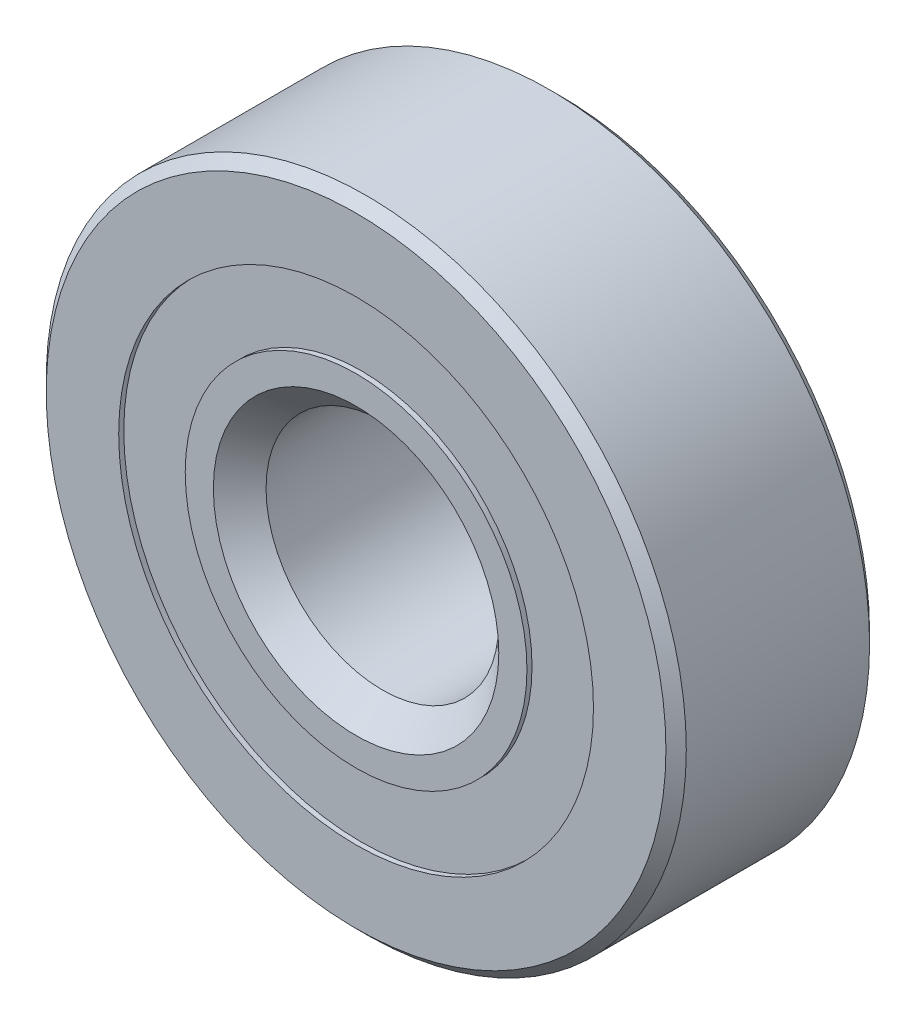
ISO-10303-21;
HEADER;
FILE_DESCRIPTION(('STEP AP214'),'2;1');
FILE_NAME('part.step','',(''),(''),'','','');
FILE_SCHEMA(('AUTOMOTIVE_DESIGN { 1 0 10303 214 1 1 1 1 }'));
ENDSEC;
DATA;
#1=APPLICATION_CONTEXT('core data for automotive mechanical design processes');
#2=APPLICATION_PROTOCOL_DEFINITION('international standard','automotive_design',2000,#1);
#3=PRODUCT_CONTEXT('',#1,'mechanical');
#4=PRODUCT('Part','Part','',(#3));
#5=PRODUCT_RELATED_PRODUCT_CATEGORY('part','',(#4));
#6=PRODUCT_DEFINITION_FORMATION('','',#4);
#7=PRODUCT_DEFINITION_CONTEXT('part definition',#1,'design');
#8=PRODUCT_DEFINITION('design','',#6,#7);
#9=PRODUCT_DEFINITION_SHAPE('','',#8);
#10=(LENGTH_UNIT() NAMED_UNIT(*) SI_UNIT(.MILLI.,.METRE.));
#11=(NAMED_UNIT(*) PLANE_ANGLE_UNIT() SI_UNIT($,.RADIAN.));
#12=(NAMED_UNIT(*) SI_UNIT($,.STERADIAN.) SOLID_ANGLE_UNIT());
#13=UNCERTAINTY_MEASURE_WITH_UNIT(LENGTH_MEASURE(1.E-05),#10,'distance_accuracy_value','');
#14=(GEOMETRIC_REPRESENTATION_CONTEXT(3) GLOBAL_UNCERTAINTY_ASSIGNED_CONTEXT((#13)) GLOBAL_UNIT_ASSIGNED_CONTEXT((#10,
#11,#12)) REPRESENTATION_CONTEXT('',''));
#15=CARTESIAN_POINT('',(0.,0.,0.));
#16=DIRECTION('',(0.,0.,1.));
#17=DIRECTION('',(1.,0.,0.));
#18=AXIS2_PLACEMENT_3D('',#15,#16,#17);
#19=CARTESIAN_POINT('',(0.,8.15934065934065,-3.32500000000001));
#20=DIRECTION('',(0.,0.,1.));
#21=DIRECTION('',(1.,0.,0.));
#22=AXIS2_PLACEMENT_3D('',#19,#20,#21);
#23=PLANE('',#22);
#24=CARTESIAN_POINT('',(0.,0.,-3.32500000000001));
#25=DIRECTION('',(0.,0.,1.));
#26=DIRECTION('',(1.,0.,0.));
#27=AXIS2_PLACEMENT_3D('',#24,#25,#26);
#28=CIRCLE('',#27,8.15934065934065);
#29=CARTESIAN_POINT('',(8.15934065934065,0.,-3.32500000000001));
#30=VERTEX_POINT('',#29);
#31=EDGE_CURVE('E57',#30,#30,#28,.T.);
#32=ORIENTED_EDGE('',*,*,#31,.F.);
#33=EDGE_LOOP('',(#32));
#34=FACE_BOUND('',#33,.T.);
#35=CARTESIAN_POINT('',(0.,0.,-3.32500000000001));
#36=DIRECTION('',(0.,0.,1.));
#37=DIRECTION('',(1.,0.,0.));
#38=AXIS2_PLACEMENT_3D('',#35,#36,#37);
#39=CIRCLE('',#38,5.87294927368765);
#40=CARTESIAN_POINT('',(5.87294927368765,0.,-3.32500000000001));
#41=VERTEX_POINT('',#40);
#42=EDGE_CURVE('E11',#41,#41,#39,.T.);
#43=ORIENTED_EDGE('',*,*,#42,.T.);
#44=EDGE_LOOP('',(#43));
#45=FACE_BOUND('',#44,.T.);
#46=ADVANCED_FACE('F43',(#34,#45),#23,.F.);
#47=CARTESIAN_POINT('',(0.,0.,3.5));
#48=DIRECTION('',(0.,0.,1.));
#49=DIRECTION('',(1.,0.,0.));
#50=AXIS2_PLACEMENT_3D('',#47,#48,#49);
#51=CYLINDRICAL_SURFACE('',#50,5.87294927368765);
#52=ORIENTED_EDGE('',*,*,#42,.F.);
#53=EDGE_LOOP('',(#52));
#54=FACE_BOUND('',#53,.T.);
#55=CARTESIAN_POINT('',(0.,0.,-1.68952158656809));
#56=DIRECTION('',(0.,0.,1.));
#57=DIRECTION('',(1.,0.,0.));
#58=AXIS2_PLACEMENT_3D('',#55,#56,#57);
#59=CIRCLE('',#58,5.87294927368765);
#60=CARTESIAN_POINT('',(5.87294927368765,0.,-1.68952158656809));
#61=VERTEX_POINT('',#60);
#62=EDGE_CURVE('E49',#61,#61,#59,.T.);
#63=ORIENTED_EDGE('',*,*,#62,.T.);
#64=EDGE_LOOP('',(#63));
#65=FACE_BOUND('',#64,.T.);
#66=ADVANCED_FACE('F66',(#54,#65),#51,.F.);
#67=CARTESIAN_POINT('',(0.,8.15934065934065,-1.68952158656809));
#68=DIRECTION('',(0.,0.,-1.));
#69=DIRECTION('',(-1.,0.,0.));
#70=AXIS2_PLACEMENT_3D('',#67,#68,#69);
#71=PLANE('',#70);
#72=ORIENTED_EDGE('',*,*,#62,.F.);
#73=EDGE_LOOP('',(#72));
#74=FACE_BOUND('',#73,.T.);
#75=CARTESIAN_POINT('',(0.,0.,-1.68952158656809));
#76=DIRECTION('',(0.,0.,1.));
#77=DIRECTION('',(1.,0.,0.));
#78=AXIS2_PLACEMENT_3D('',#75,#76,#77);
#79=CIRCLE('',#78,8.15934065934065);
#80=CARTESIAN_POINT('',(8.15934065934065,0.,-1.68952158656809));
#81=VERTEX_POINT('',#80);
#82=EDGE_CURVE('E53',#81,#81,#79,.T.);
#83=ORIENTED_EDGE('',*,*,#82,.T.);
#84=EDGE_LOOP('',(#83));
#85=FACE_BOUND('',#84,.T.);
#86=ADVANCED_FACE('F70',(#74,#85),#71,.F.);
#87=CARTESIAN_POINT('',(0.,0.,3.5));
#88=DIRECTION('',(0.,0.,1.));
#89=DIRECTION('',(1.,0.,0.));
#90=AXIS2_PLACEMENT_3D('',#87,#88,#89);
#91=CYLINDRICAL_SURFACE('',#90,8.15934065934065);
#92=ORIENTED_EDGE('',*,*,#82,.F.);
#93=EDGE_LOOP('',(#92));
#94=FACE_BOUND('',#93,.T.);
#95=ORIENTED_EDGE('',*,*,#31,.T.);
#96=EDGE_LOOP('',(#95));
#97=FACE_BOUND('',#96,.T.);
#98=ADVANCED_FACE('F63',(#94,#97),#91,.T.);
#99=CLOSED_SHELL('',(#46,#66,#86,#98));
#100=MANIFOLD_SOLID_BREP('B2',#99);
#101=CARTESIAN_POINT('',(0.,8.15934065934065,3.325));
#102=DIRECTION('',(0.,0.,-1.));
#103=DIRECTION('',(-1.,0.,0.));
#104=AXIS2_PLACEMENT_3D('',#101,#102,#103);
#105=PLANE('',#104);
#106=CARTESIAN_POINT('',(0.,0.,3.325));
#107=DIRECTION('',(0.,0.,1.));
#108=DIRECTION('',(1.,0.,0.));
#109=AXIS2_PLACEMENT_3D('',#106,#107,#108);
#110=CIRCLE('',#109,5.87294927368765);
#111=CARTESIAN_POINT('',(5.87294927368765,0.,3.325));
#112=VERTEX_POINT('',#111);
#113=EDGE_CURVE('E42',#112,#112,#110,.T.);
#114=ORIENTED_EDGE('',*,*,#113,.F.);
#115=EDGE_LOOP('',(#114));
#116=FACE_BOUND('',#115,.T.);
#117=CARTESIAN_POINT('',(0.,0.,3.325));
#118=DIRECTION('',(0.,0.,1.));
#119=DIRECTION('',(1.,0.,0.));
#120=AXIS2_PLACEMENT_3D('',#117,#118,#119);
#121=CIRCLE('',#120,8.15934065934065);
#122=CARTESIAN_POINT('',(8.15934065934065,0.,3.325));
#123=VERTEX_POINT('',#122);
#124=EDGE_CURVE('E124',#123,#123,#121,.T.);
#125=ORIENTED_EDGE('',*,*,#124,.T.);
#126=EDGE_LOOP('',(#125));
#127=FACE_BOUND('',#126,.T.);
#128=ADVANCED_FACE('F110',(#116,#127),#105,.F.);
#129=CARTESIAN_POINT('',(0.,0.,3.5));
#130=DIRECTION('',(0.,0.,1.));
#131=DIRECTION('',(1.,0.,0.));
#132=AXIS2_PLACEMENT_3D('',#129,#130,#131);
#133=CYLINDRICAL_SURFACE('',#132,5.87294927368765);
#134=CARTESIAN_POINT('',(0.,0.,1.68952158656808));
#135=DIRECTION('',(0.,0.,1.));
#136=DIRECTION('',(1.,0.,0.));
#137=AXIS2_PLACEMENT_3D('',#134,#135,#136);
#138=CIRCLE('',#137,5.87294927368765);
#139=CARTESIAN_POINT('',(5.87294927368765,0.,1.68952158656808));
#140=VERTEX_POINT('',#139);
#141=EDGE_CURVE('E116',#140,#140,#138,.T.);
#142=ORIENTED_EDGE('',*,*,#141,.F.);
#143=EDGE_LOOP('',(#142));
#144=FACE_BOUND('',#143,.T.);
#145=ORIENTED_EDGE('',*,*,#113,.T.);
#146=EDGE_LOOP('',(#145));
#147=FACE_BOUND('',#146,.T.);
#148=ADVANCED_FACE('F139',(#144,#147),#133,.F.);
#149=CARTESIAN_POINT('',(0.,8.15934065934065,1.68952158656808));
#150=DIRECTION('',(0.,0.,1.));
#151=DIRECTION('',(1.,0.,0.));
#152=AXIS2_PLACEMENT_3D('',#149,#150,#151);
#153=PLANE('',#152);
#154=CARTESIAN_POINT('',(0.,0.,1.68952158656808));
#155=DIRECTION('',(0.,0.,1.));
#156=DIRECTION('',(1.,0.,0.));
#157=AXIS2_PLACEMENT_3D('',#154,#155,#156);
#158=CIRCLE('',#157,8.15934065934065);
#159=CARTESIAN_POINT('',(8.15934065934065,0.,1.68952158656808));
#160=VERTEX_POINT('',#159);
#161=EDGE_CURVE('E120',#160,#160,#158,.T.);
#162=ORIENTED_EDGE('',*,*,#161,.F.);
#163=EDGE_LOOP('',(#162));
#164=FACE_BOUND('',#163,.T.);
#165=ORIENTED_EDGE('',*,*,#141,.T.);
#166=EDGE_LOOP('',(#165));
#167=FACE_BOUND('',#166,.T.);
#168=ADVANCED_FACE('F134',(#164,#167),#153,.F.);
#169=CARTESIAN_POINT('',(0.,0.,3.5));
#170=DIRECTION('',(0.,0.,1.));
#171=DIRECTION('',(1.,0.,0.));
#172=AXIS2_PLACEMENT_3D('',#169,#170,#171);
#173=CYLINDRICAL_SURFACE('',#172,8.15934065934065);
#174=ORIENTED_EDGE('',*,*,#124,.F.);
#175=EDGE_LOOP('',(#174));
#176=FACE_BOUND('',#175,.T.);
#177=ORIENTED_EDGE('',*,*,#161,.T.);
#178=EDGE_LOOP('',(#177));
#179=FACE_BOUND('',#178,.T.);
#180=ADVANCED_FACE('F131',(#176,#179),#173,.T.);
#181=CLOSED_SHELL('',(#128,#148,#168,#180));
#182=MANIFOLD_SOLID_BREP('B6',#181);
#183=CARTESIAN_POINT('',(-3.74999999999992,6.49519052838334,0.));
#184=DIRECTION('',(0.,0.,1.));
#185=DIRECTION('',(-0.499999999999989,0.866025403784445,0.));
#186=AXIS2_PLACEMENT_3D('',#183,#184,#185);
#187=SPHERICAL_SURFACE('',#186,1.68952158656808);
#188=CARTESIAN_POINT('',(-3.74999999999992,6.49519052838334,1.68952158656808));
#189=VERTEX_POINT('',#188);
#190=VERTEX_LOOP('',#189);
#191=FACE_BOUND('',#190,.T.);
#192=ADVANCED_FACE('F190',(#191),#187,.T.);
#193=CLOSED_SHELL('',(#192));
#194=MANIFOLD_SOLID_BREP('B37',#193);
#195=CARTESIAN_POINT('',(-6.49519052838325,3.75000000000008,0.));
#196=DIRECTION('',(0.,0.,1.));
#197=DIRECTION('',(-0.866025403784433,0.50000000000001,0.));
#198=AXIS2_PLACEMENT_3D('',#195,#196,#197);
#199=SPHERICAL_SURFACE('',#198,1.68952158656808);
#200=CARTESIAN_POINT('',(-6.49519052838325,3.75000000000008,1.68952158656808));
#201=VERTEX_POINT('',#200);
#202=VERTEX_LOOP('',#201);
#203=FACE_BOUND('',#202,.T.);
#204=ADVANCED_FACE('F221',(#203),#199,.T.);
#205=CLOSED_SHELL('',(#204));
#206=MANIFOLD_SOLID_BREP('B106',#205);
#207=CARTESIAN_POINT('',(-7.5,0.,0.));
#208=DIRECTION('',(0.,0.,1.));
#209=DIRECTION('',(-1.,0.,0.));
#210=AXIS2_PLACEMENT_3D('',#207,#208,#209);
#211=SPHERICAL_SURFACE('',#210,1.68952158656808);
#212=CARTESIAN_POINT('',(-7.5,0.,1.68952158656808));
#213=VERTEX_POINT('',#212);
#214=VERTEX_LOOP('',#213);
#215=FACE_BOUND('',#214,.T.);
#216=ADVANCED_FACE('F252',(#215),#211,.T.);
#217=CLOSED_SHELL('',(#216));
#218=MANIFOLD_SOLID_BREP('B186',#217);
#219=CARTESIAN_POINT('',(-6.49519052838332,-3.74999999999994,0.));
#220=DIRECTION('',(0.,0.,1.));
#221=DIRECTION('',(-0.866025403784443,-0.499999999999992,0.));
#222=AXIS2_PLACEMENT_3D('',#219,#220,#221);
#223=SPHERICAL_SURFACE('',#222,1.68952158656808);
#224=CARTESIAN_POINT('',(-6.49519052838332,-3.74999999999994,1.68952158656808));
#225=VERTEX_POINT('',#224);
#226=VERTEX_LOOP('',#225);
#227=FACE_BOUND('',#226,.T.);
#228=ADVANCED_FACE('F283',(#227),#223,.T.);
#229=CLOSED_SHELL('',(#228));
#230=MANIFOLD_SOLID_BREP('B217',#229);
#231=CARTESIAN_POINT('',(-3.75000000000005,-6.49519052838326,0.));
#232=DIRECTION('',(0.,0.,1.));
#233=DIRECTION('',(-0.500000000000007,-0.866025403784435,0.));
#234=AXIS2_PLACEMENT_3D('',#231,#232,#233);
#235=SPHERICAL_SURFACE('',#234,1.68952158656808);
#236=CARTESIAN_POINT('',(-3.75000000000005,-6.49519052838326,1.68952158656808));
#237=VERTEX_POINT('',#236);
#238=VERTEX_LOOP('',#237);
#239=FACE_BOUND('',#238,.T.);
#240=ADVANCED_FACE('F314',(#239),#235,.T.);
#241=CLOSED_SHELL('',(#240));
#242=MANIFOLD_SOLID_BREP('B248',#241);
#243=CARTESIAN_POINT('',(0.,-7.5,0.));
#244=DIRECTION('',(0.,0.,1.));
#245=DIRECTION('',(0.,-1.,0.));
#246=AXIS2_PLACEMENT_3D('',#243,#244,#245);
#247=SPHERICAL_SURFACE('',#246,1.68952158656808);
#248=CARTESIAN_POINT('',(0.,-7.5,1.68952158656808));
#249=VERTEX_POINT('',#248);
#250=VERTEX_LOOP('',#249);
#251=FACE_BOUND('',#250,.T.);
#252=ADVANCED_FACE('F345',(#251),#247,.T.);
#253=CLOSED_SHELL('',(#252));
#254=MANIFOLD_SOLID_BREP('B279',#253);
#255=CARTESIAN_POINT('',(3.74999999999996,-6.49519052838331,0.));
#256=DIRECTION('',(0.,0.,1.));
#257=DIRECTION('',(0.499999999999995,-0.866025403784442,0.));
#258=AXIS2_PLACEMENT_3D('',#255,#256,#257);
#259=SPHERICAL_SURFACE('',#258,1.68952158656808);
#260=CARTESIAN_POINT('',(3.74999999999996,-6.49519052838331,1.68952158656808));
#261=VERTEX_POINT('',#260);
#262=VERTEX_LOOP('',#261);
#263=FACE_BOUND('',#262,.T.);
#264=ADVANCED_FACE('F376',(#263),#259,.T.);
#265=CLOSED_SHELL('',(#264));
#266=MANIFOLD_SOLID_BREP('B310',#265);
#267=CARTESIAN_POINT('',(6.49519052838327,-3.75000000000003,0.));
#268=DIRECTION('',(0.,0.,1.));
#269=DIRECTION('',(0.866025403784436,-0.500000000000004,0.));
#270=AXIS2_PLACEMENT_3D('',#267,#268,#269);
#271=SPHERICAL_SURFACE('',#270,1.68952158656808);
#272=CARTESIAN_POINT('',(6.49519052838327,-3.75000000000003,1.68952158656808));
#273=VERTEX_POINT('',#272);
#274=VERTEX_LOOP('',#273);
#275=FACE_BOUND('',#274,.T.);
#276=ADVANCED_FACE('F407',(#275),#271,.T.);
#277=CLOSED_SHELL('',(#276));
#278=MANIFOLD_SOLID_BREP('B341',#277);
#279=CARTESIAN_POINT('',(7.5,0.,0.));
#280=DIRECTION('',(0.,0.,1.));
#281=DIRECTION('',(1.,0.,0.));
#282=AXIS2_PLACEMENT_3D('',#279,#280,#281);
#283=SPHERICAL_SURFACE('',#282,1.68952158656808);
#284=CARTESIAN_POINT('',(7.5,0.,1.68952158656808));
#285=VERTEX_POINT('',#284);
#286=VERTEX_LOOP('',#285);
#287=FACE_BOUND('',#286,.T.);
#288=ADVANCED_FACE('F438',(#287),#283,.T.);
#289=CLOSED_SHELL('',(#288));
#290=MANIFOLD_SOLID_BREP('B372',#289);
#291=CARTESIAN_POINT('',(6.4951905283833,3.74999999999998,0.));
#292=DIRECTION('',(0.,0.,1.));
#293=DIRECTION('',(0.86602540378444,0.499999999999998,0.));
#294=AXIS2_PLACEMENT_3D('',#291,#292,#293);
#295=SPHERICAL_SURFACE('',#294,1.68952158656808);
#296=CARTESIAN_POINT('',(6.4951905283833,3.74999999999998,1.68952158656808));
#297=VERTEX_POINT('',#296);
#298=VERTEX_LOOP('',#297);
#299=FACE_BOUND('',#298,.T.);
#300=ADVANCED_FACE('F469',(#299),#295,.T.);
#301=CLOSED_SHELL('',(#300));
#302=MANIFOLD_SOLID_BREP('B403',#301);
#303=CARTESIAN_POINT('',(3.75000000000001,6.49519052838328,0.));
#304=DIRECTION('',(0.,0.,1.));
#305=DIRECTION('',(0.500000000000001,0.866025403784438,0.));
#306=AXIS2_PLACEMENT_3D('',#303,#304,#305);
#307=SPHERICAL_SURFACE('',#306,1.68952158656808);
#308=CARTESIAN_POINT('',(3.75000000000001,6.49519052838328,1.68952158656808));
#309=VERTEX_POINT('',#308);
#310=VERTEX_LOOP('',#309);
#311=FACE_BOUND('',#310,.T.);
#312=ADVANCED_FACE('F500',(#311),#307,.T.);
#313=CLOSED_SHELL('',(#312));
#314=MANIFOLD_SOLID_BREP('B434',#313);
#315=CARTESIAN_POINT('',(0.,7.5,0.));
#316=DIRECTION('',(0.,0.,1.));
#317=DIRECTION('',(0.,1.,0.));
#318=AXIS2_PLACEMENT_3D('',#315,#316,#317);
#319=SPHERICAL_SURFACE('',#318,1.68952158656808);
#320=CARTESIAN_POINT('',(0.,7.5,1.68952158656808));
#321=VERTEX_POINT('',#320);
#322=VERTEX_LOOP('',#321);
#323=FACE_BOUND('',#322,.T.);
#324=ADVANCED_FACE('F533',(#323),#319,.T.);
#325=CLOSED_SHELL('',(#324));
#326=MANIFOLD_SOLID_BREP('B465',#325);
#327=CARTESIAN_POINT('',(0.,0.,3.5));
#328=DIRECTION('',(0.,0.,1.));
#329=DIRECTION('',(1.,0.,0.));
#330=AXIS2_PLACEMENT_3D('',#327,#328,#329);
#331=CYLINDRICAL_SURFACE('',#330,5.87294927368765);
#332=CARTESIAN_POINT('',(0.,0.,3.5));
#333=DIRECTION('',(0.,0.,1.));
#334=DIRECTION('',(1.,0.,0.));
#335=AXIS2_PLACEMENT_3D('',#332,#333,#334);
#336=CIRCLE('',#335,5.87294927368765);
#337=CARTESIAN_POINT('',(5.87294927368765,0.,3.5));
#338=VERTEX_POINT('',#337);
#339=EDGE_CURVE('E592',#338,#338,#336,.T.);
#340=ORIENTED_EDGE('',*,*,#339,.F.);
#341=EDGE_LOOP('',(#340));
#342=FACE_BOUND('',#341,.T.);
#343=CARTESIAN_POINT('',(0.,0.,3.325));
#344=DIRECTION('',(0.,0.,1.));
#345=DIRECTION('',(1.,0.,0.));
#346=AXIS2_PLACEMENT_3D('',#343,#344,#345);
#347=CIRCLE('',#346,5.87294927368765);
#348=CARTESIAN_POINT('',(5.87294927368765,0.,3.325));
#349=VERTEX_POINT('',#348);
#350=EDGE_CURVE('E532',#349,#349,#347,.T.);
#351=ORIENTED_EDGE('',*,*,#350,.T.);
#352=EDGE_LOOP('',(#351));
#353=FACE_BOUND('',#352,.T.);
#354=ADVANCED_FACE('F552',(#342,#353),#331,.T.);
#355=CARTESIAN_POINT('',(0.,5.87294927368765,3.325));
#356=DIRECTION('',(0.,0.,1.));
#357=DIRECTION('',(1.,0.,0.));
#358=AXIS2_PLACEMENT_3D('',#355,#356,#357);
#359=PLANE('',#358);
#360=ORIENTED_EDGE('',*,*,#350,.F.);
#361=EDGE_LOOP('',(#360));
#362=FACE_BOUND('',#361,.T.);
#363=CARTESIAN_POINT('',(0.,0.,3.325));
#364=DIRECTION('',(0.,0.,1.));
#365=DIRECTION('',(1.,0.,0.));
#366=AXIS2_PLACEMENT_3D('',#363,#364,#365);
#367=CIRCLE('',#366,5.69794927368765);
#368=CARTESIAN_POINT('',(5.69794927368765,0.,3.325));
#369=VERTEX_POINT('',#368);
#370=EDGE_CURVE('E558',#369,#369,#367,.T.);
#371=ORIENTED_EDGE('',*,*,#370,.T.);
#372=EDGE_LOOP('',(#371));
#373=FACE_BOUND('',#372,.T.);
#374=ADVANCED_FACE('F599',(#362,#373),#359,.F.);
#375=CARTESIAN_POINT('',(0.,0.,2.53228993302831));
#376=DIRECTION('',(0.,0.,1.));
#377=DIRECTION('',(1.,0.,0.));
#378=AXIS2_PLACEMENT_3D('',#375,#376,#377);
#379=CONICAL_SURFACE('',#378,4.90523920671596,0.785398163397449);
#380=ORIENTED_EDGE('',*,*,#370,.F.);
#381=EDGE_LOOP('',(#380));
#382=FACE_BOUND('',#381,.T.);
#383=CARTESIAN_POINT('',(0.,0.,2.53228993302831));
#384=DIRECTION('',(0.,0.,1.));
#385=DIRECTION('',(1.,0.,0.));
#386=AXIS2_PLACEMENT_3D('',#383,#384,#385);
#387=CIRCLE('',#386,4.90523920671596);
#388=CARTESIAN_POINT('',(4.90523920671596,0.,2.53228993302831));
#389=VERTEX_POINT('',#388);
#390=EDGE_CURVE('E562',#389,#389,#387,.T.);
#391=ORIENTED_EDGE('',*,*,#390,.T.);
#392=EDGE_LOOP('',(#391));
#393=FACE_BOUND('',#392,.T.);
#394=ADVANCED_FACE('F603',(#382,#393),#379,.T.);
#395=CARTESIAN_POINT('',(0.,0.,3.5));
#396=DIRECTION('',(0.,0.,1.));
#397=DIRECTION('',(1.,0.,0.));
#398=AXIS2_PLACEMENT_3D('',#395,#396,#397);
#399=CYLINDRICAL_SURFACE('',#398,4.90523920671596);
#400=ORIENTED_EDGE('',*,*,#390,.F.);
#401=EDGE_LOOP('',(#400));
#402=FACE_BOUND('',#401,.T.);
#403=CARTESIAN_POINT('',(0.,0.,0.));
#404=DIRECTION('',(0.,0.,1.));
#405=DIRECTION('',(1.,0.,0.));
#406=AXIS2_PLACEMENT_3D('',#403,#404,#405);
#407=CIRCLE('',#406,4.90523920671596);
#408=CARTESIAN_POINT('',(4.90523920671596,0.,0.));
#409=VERTEX_POINT('',#408);
#410=EDGE_CURVE('E566',#409,#409,#407,.T.);
#411=ORIENTED_EDGE('',*,*,#410,.T.);
#412=EDGE_LOOP('',(#411));
#413=FACE_BOUND('',#412,.T.);
#414=ADVANCED_FACE('F608',(#402,#413),#399,.T.);
#415=CARTESIAN_POINT('',(0.,4.90523920671596,0.));
#416=DIRECTION('',(0.,0.,-1.));
#417=DIRECTION('',(-1.,0.,0.));
#418=AXIS2_PLACEMENT_3D('',#415,#416,#417);
#419=PLANE('',#418);
#420=ORIENTED_EDGE('',*,*,#410,.F.);
#421=EDGE_LOOP('',(#420));
#422=FACE_BOUND('',#421,.T.);
#423=CARTESIAN_POINT('',(0.,0.,0.));
#424=DIRECTION('',(0.,0.,1.));
#425=DIRECTION('',(1.,0.,0.));
#426=AXIS2_PLACEMENT_3D('',#423,#424,#425);
#427=CIRCLE('',#426,5.81047841343192);
#428=CARTESIAN_POINT('',(5.81047841343192,0.,0.));
#429=VERTEX_POINT('',#428);
#430=EDGE_CURVE('E571',#429,#429,#427,.T.);
#431=ORIENTED_EDGE('',*,*,#430,.T.);
#432=EDGE_LOOP('',(#431));
#433=FACE_BOUND('',#432,.T.);
#434=ADVANCED_FACE('F614',(#422,#433),#419,.F.);
#435=CARTESIAN_POINT('',(0.,0.,0.));
#436=DIRECTION('',(0.,0.,1.));
#437=DIRECTION('',(1.,0.,0.));
#438=AXIS2_PLACEMENT_3D('',#435,#436,#437);
#439=TOROIDAL_SURFACE('',#438,7.5,1.68952158656808);
#440=ORIENTED_EDGE('',*,*,#430,.F.);
#441=EDGE_LOOP('',(#440));
#442=FACE_BOUND('',#441,.T.);
#443=CARTESIAN_POINT('',(0.,0.,-1.55555555555555));
#444=DIRECTION('',(0.,0.,1.));
#445=DIRECTION('',(1.,0.,0.));
#446=AXIS2_PLACEMENT_3D('',#443,#444,#445);
#447=CIRCLE('',#446,6.84065934065934);
#448=CARTESIAN_POINT('',(6.84065934065934,0.,-1.55555555555555));
#449=VERTEX_POINT('',#448);
#450=EDGE_CURVE('E574',#449,#449,#447,.T.);
#451=ORIENTED_EDGE('',*,*,#450,.T.);
#452=EDGE_LOOP('',(#451));
#453=FACE_BOUND('',#452,.T.);
#454=ADVANCED_FACE('F618',(#442,#453),#439,.F.);
#455=CARTESIAN_POINT('',(0.,0.,3.5));
#456=DIRECTION('',(0.,0.,1.));
#457=DIRECTION('',(1.,0.,0.));
#458=AXIS2_PLACEMENT_3D('',#455,#456,#457);
#459=CYLINDRICAL_SURFACE('',#458,6.84065934065934);
#460=ORIENTED_EDGE('',*,*,#450,.F.);
#461=EDGE_LOOP('',(#460));
#462=FACE_BOUND('',#461,.T.);
#463=CARTESIAN_POINT('',(0.,0.,-3.5));
#464=DIRECTION('',(0.,0.,1.));
#465=DIRECTION('',(1.,0.,0.));
#466=AXIS2_PLACEMENT_3D('',#463,#464,#465);
#467=CIRCLE('',#466,6.84065934065934);
#468=CARTESIAN_POINT('',(6.84065934065934,0.,-3.5));
#469=VERTEX_POINT('',#468);
#470=EDGE_CURVE('E577',#469,#469,#467,.T.);
#471=ORIENTED_EDGE('',*,*,#470,.T.);
#472=EDGE_LOOP('',(#471));
#473=FACE_BOUND('',#472,.T.);
#474=ADVANCED_FACE('F622',(#462,#473),#459,.T.);
#475=CARTESIAN_POINT('',(0.,4.35,-3.50000000000001));
#476=DIRECTION('',(0.,0.,1.));
#477=DIRECTION('',(1.,0.,0.));
#478=AXIS2_PLACEMENT_3D('',#475,#476,#477);
#479=PLANE('',#478);
#480=ORIENTED_EDGE('',*,*,#470,.F.);
#481=EDGE_LOOP('',(#480));
#482=FACE_BOUND('',#481,.T.);
#483=CARTESIAN_POINT('',(0.,0.,-3.50000000000001));
#484=DIRECTION('',(0.,0.,1.));
#485=DIRECTION('',(1.,0.,0.));
#486=AXIS2_PLACEMENT_3D('',#483,#484,#485);
#487=CIRCLE('',#486,4.35);
#488=CARTESIAN_POINT('',(4.35,0.,-3.50000000000001));
#489=VERTEX_POINT('',#488);
#490=EDGE_CURVE('E580',#489,#489,#487,.T.);
#491=ORIENTED_EDGE('',*,*,#490,.T.);
#492=EDGE_LOOP('',(#491));
#493=FACE_BOUND('',#492,.T.);
#494=ADVANCED_FACE('F626',(#482,#493),#479,.F.);
#495=CARTESIAN_POINT('',(0.,0.,-3.15000000000001));
#496=DIRECTION('',(0.,0.,-1.));
#497=DIRECTION('',(-1.,0.,0.));
#498=AXIS2_PLACEMENT_3D('',#495,#496,#497);
#499=CONICAL_SURFACE('',#498,4.,0.785398163397446);
#500=ORIENTED_EDGE('',*,*,#490,.F.);
#501=EDGE_LOOP('',(#500));
#502=FACE_BOUND('',#501,.T.);
#503=CARTESIAN_POINT('',(0.,0.,-3.15000000000001));
#504=DIRECTION('',(0.,0.,1.));
#505=DIRECTION('',(1.,0.,0.));
#506=AXIS2_PLACEMENT_3D('',#503,#504,#505);
#507=CIRCLE('',#506,4.);
#508=CARTESIAN_POINT('',(4.,0.,-3.15000000000001));
#509=VERTEX_POINT('',#508);
#510=EDGE_CURVE('E583',#509,#509,#507,.T.);
#511=ORIENTED_EDGE('',*,*,#510,.T.);
#512=EDGE_LOOP('',(#511));
#513=FACE_BOUND('',#512,.T.);
#514=ADVANCED_FACE('F630',(#502,#513),#499,.F.);
#515=CARTESIAN_POINT('',(0.,0.,3.5));
#516=DIRECTION('',(0.,0.,1.));
#517=DIRECTION('',(1.,0.,0.));
#518=AXIS2_PLACEMENT_3D('',#515,#516,#517);
#519=CYLINDRICAL_SURFACE('',#518,4.);
#520=ORIENTED_EDGE('',*,*,#510,.F.);
#521=EDGE_LOOP('',(#520));
#522=FACE_BOUND('',#521,.T.);
#523=CARTESIAN_POINT('',(0.,0.,2.59476079328404));
#524=DIRECTION('',(0.,0.,1.));
#525=DIRECTION('',(1.,0.,0.));
#526=AXIS2_PLACEMENT_3D('',#523,#524,#525);
#527=CIRCLE('',#526,4.);
#528=CARTESIAN_POINT('',(4.,0.,2.59476079328404));
#529=VERTEX_POINT('',#528);
#530=EDGE_CURVE('E586',#529,#529,#527,.T.);
#531=ORIENTED_EDGE('',*,*,#530,.T.);
#532=EDGE_LOOP('',(#531));
#533=FACE_BOUND('',#532,.T.);
#534=ADVANCED_FACE('F634',(#522,#533),#519,.F.);
#535=CARTESIAN_POINT('',(0.,0.,3.5));
#536=DIRECTION('',(0.,0.,1.));
#537=DIRECTION('',(1.,0.,0.));
#538=AXIS2_PLACEMENT_3D('',#535,#536,#537);
#539=CONICAL_SURFACE('',#538,4.90523920671596,0.785398163397448);
#540=ORIENTED_EDGE('',*,*,#530,.F.);
#541=EDGE_LOOP('',(#540));
#542=FACE_BOUND('',#541,.T.);
#543=CARTESIAN_POINT('',(0.,0.,3.5));
#544=DIRECTION('',(0.,0.,1.));
#545=DIRECTION('',(1.,0.,0.));
#546=AXIS2_PLACEMENT_3D('',#543,#544,#545);
#547=CIRCLE('',#546,4.90523920671596);
#548=CARTESIAN_POINT('',(4.90523920671596,0.,3.5));
#549=VERTEX_POINT('',#548);
#550=EDGE_CURVE('E589',#549,#549,#547,.T.);
#551=ORIENTED_EDGE('',*,*,#550,.T.);
#552=EDGE_LOOP('',(#551));
#553=FACE_BOUND('',#552,.T.);
#554=ADVANCED_FACE('F638',(#542,#553),#539,.F.);
#555=CARTESIAN_POINT('',(0.,5.87294927368765,3.5));
#556=DIRECTION('',(0.,0.,-1.));
#557=DIRECTION('',(-1.,0.,0.));
#558=AXIS2_PLACEMENT_3D('',#555,#556,#557);
#559=PLANE('',#558);
#560=ORIENTED_EDGE('',*,*,#550,.F.);
#561=EDGE_LOOP('',(#560));
#562=FACE_BOUND('',#561,.T.);
#563=ORIENTED_EDGE('',*,*,#339,.T.);
#564=EDGE_LOOP('',(#563));
#565=FACE_BOUND('',#564,.T.);
#566=ADVANCED_FACE('F596',(#562,#565),#559,.F.);
#567=CLOSED_SHELL('',(#354,#374,#394,#414,#434,#454,#474,#494,#514,#534,#554,#566));
#568=MANIFOLD_SOLID_BREP('B496',#567);
#569=CARTESIAN_POINT('',(0.,0.,3.15));
#570=DIRECTION('',(0.,0.,-1.));
#571=DIRECTION('',(-1.,0.,0.));
#572=AXIS2_PLACEMENT_3D('',#569,#570,#571);
#573=CONICAL_SURFACE('',#572,11.,0.785398163397454);
#574=CARTESIAN_POINT('',(0.,0.,3.5));
#575=DIRECTION('',(0.,0.,1.));
#576=DIRECTION('',(1.,0.,0.));
#577=AXIS2_PLACEMENT_3D('',#574,#575,#576);
#578=CIRCLE('',#577,10.65);
#579=CARTESIAN_POINT('',(10.65,0.,3.5));
#580=VERTEX_POINT('',#579);
#581=EDGE_CURVE('E761',#580,#580,#578,.T.);
#582=ORIENTED_EDGE('',*,*,#581,.F.);
#583=EDGE_LOOP('',(#582));
#584=FACE_BOUND('',#583,.T.);
#585=CARTESIAN_POINT('',(0.,0.,3.15));
#586=DIRECTION('',(0.,0.,1.));
#587=DIRECTION('',(1.,0.,0.));
#588=AXIS2_PLACEMENT_3D('',#585,#586,#587);
#589=CIRCLE('',#588,11.);
#590=CARTESIAN_POINT('',(11.,0.,3.15));
#591=VERTEX_POINT('',#590);
#592=EDGE_CURVE('E551',#591,#591,#589,.T.);
#593=ORIENTED_EDGE('',*,*,#592,.T.);
#594=EDGE_LOOP('',(#593));
#595=FACE_BOUND('',#594,.T.);
#596=ADVANCED_FACE('F733',(#584,#595),#573,.T.);
#597=CARTESIAN_POINT('',(0.,0.,3.5));
#598=DIRECTION('',(0.,0.,1.));
#599=DIRECTION('',(1.,0.,0.));
#600=AXIS2_PLACEMENT_3D('',#597,#598,#599);
#601=CYLINDRICAL_SURFACE('',#600,11.);
#602=ORIENTED_EDGE('',*,*,#592,.F.);
#603=EDGE_LOOP('',(#602));
#604=FACE_BOUND('',#603,.T.);
#605=CARTESIAN_POINT('',(0.,0.,-3.15000000000001));
#606=DIRECTION('',(0.,0.,1.));
#607=DIRECTION('',(1.,0.,0.));
#608=AXIS2_PLACEMENT_3D('',#605,#606,#607);
#609=CIRCLE('',#608,11.);
#610=CARTESIAN_POINT('',(11.,0.,-3.15000000000001));
#611=VERTEX_POINT('',#610);
#612=EDGE_CURVE('E739',#611,#611,#609,.T.);
#613=ORIENTED_EDGE('',*,*,#612,.T.);
#614=EDGE_LOOP('',(#613));
#615=FACE_BOUND('',#614,.T.);
#616=ADVANCED_FACE('F768',(#604,#615),#601,.T.);
#617=CARTESIAN_POINT('',(0.,0.,-3.50000000000001));
#618=DIRECTION('',(0.,0.,1.));
#619=DIRECTION('',(1.,0.,0.));
#620=AXIS2_PLACEMENT_3D('',#617,#618,#619);
#621=CONICAL_SURFACE('',#620,10.65,0.785398163397454);
#622=ORIENTED_EDGE('',*,*,#612,.F.);
#623=EDGE_LOOP('',(#622));
#624=FACE_BOUND('',#623,.T.);
#625=CARTESIAN_POINT('',(0.,0.,-3.50000000000001));
#626=DIRECTION('',(0.,0.,1.));
#627=DIRECTION('',(1.,0.,0.));
#628=AXIS2_PLACEMENT_3D('',#625,#626,#627);
#629=CIRCLE('',#628,10.65);
#630=CARTESIAN_POINT('',(10.65,0.,-3.50000000000001));
#631=VERTEX_POINT('',#630);
#632=EDGE_CURVE('E743',#631,#631,#629,.T.);
#633=ORIENTED_EDGE('',*,*,#632,.T.);
#634=EDGE_LOOP('',(#633));
#635=FACE_BOUND('',#634,.T.);
#636=ADVANCED_FACE('F772',(#624,#635),#621,.T.);
#637=CARTESIAN_POINT('',(0.,10.65,-3.50000000000001));
#638=DIRECTION('',(0.,0.,1.));
#639=DIRECTION('',(1.,0.,0.));
#640=AXIS2_PLACEMENT_3D('',#637,#638,#639);
#641=PLANE('',#640);
#642=ORIENTED_EDGE('',*,*,#632,.F.);
#643=EDGE_LOOP('',(#642));
#644=FACE_BOUND('',#643,.T.);
#645=CARTESIAN_POINT('',(0.,0.,-3.50000000000001));
#646=DIRECTION('',(0.,0.,1.));
#647=DIRECTION('',(1.,0.,0.));
#648=AXIS2_PLACEMENT_3D('',#645,#646,#647);
#649=CIRCLE('',#648,8.15934065934065);
#650=CARTESIAN_POINT('',(8.15934065934065,0.,-3.50000000000001));
#651=VERTEX_POINT('',#650);
#652=EDGE_CURVE('E747',#651,#651,#649,.T.);
#653=ORIENTED_EDGE('',*,*,#652,.T.);
#654=EDGE_LOOP('',(#653));
#655=FACE_BOUND('',#654,.T.);
#656=ADVANCED_FACE('F777',(#644,#655),#641,.F.);
#657=CARTESIAN_POINT('',(0.,0.,3.5));
#658=DIRECTION('',(0.,0.,1.));
#659=DIRECTION('',(1.,0.,0.));
#660=AXIS2_PLACEMENT_3D('',#657,#658,#659);
#661=CYLINDRICAL_SURFACE('',#660,8.15934065934065);
#662=ORIENTED_EDGE('',*,*,#652,.F.);
#663=EDGE_LOOP('',(#662));
#664=FACE_BOUND('',#663,.T.);
#665=CARTESIAN_POINT('',(0.,0.,-1.55555555555556));
#666=DIRECTION('',(0.,0.,1.));
#667=DIRECTION('',(1.,0.,0.));
#668=AXIS2_PLACEMENT_3D('',#665,#666,#667);
#669=CIRCLE('',#668,8.15934065934066);
#670=CARTESIAN_POINT('',(8.15934065934066,0.,-1.55555555555556));
#671=VERTEX_POINT('',#670);
#672=EDGE_CURVE('E752',#671,#671,#669,.T.);
#673=ORIENTED_EDGE('',*,*,#672,.T.);
#674=EDGE_LOOP('',(#673));
#675=FACE_BOUND('',#674,.T.);
#676=ADVANCED_FACE('F783',(#664,#675),#661,.F.);
#677=CARTESIAN_POINT('',(0.,0.,0.));
#678=DIRECTION('',(0.,0.,1.));
#679=DIRECTION('',(1.,0.,0.));
#680=AXIS2_PLACEMENT_3D('',#677,#678,#679);
#681=TOROIDAL_SURFACE('',#680,7.5,1.68952158656808);
#682=ORIENTED_EDGE('',*,*,#672,.F.);
#683=EDGE_LOOP('',(#682));
#684=FACE_BOUND('',#683,.T.);
#685=CARTESIAN_POINT('',(0.,0.,1.55555555555555));
#686=DIRECTION('',(0.,0.,1.));
#687=DIRECTION('',(1.,0.,0.));
#688=AXIS2_PLACEMENT_3D('',#685,#686,#687);
#689=CIRCLE('',#688,8.15934065934066);
#690=CARTESIAN_POINT('',(8.15934065934066,0.,1.55555555555555));
#691=VERTEX_POINT('',#690);
#692=EDGE_CURVE('E755',#691,#691,#689,.T.);
#693=ORIENTED_EDGE('',*,*,#692,.T.);
#694=EDGE_LOOP('',(#693));
#695=FACE_BOUND('',#694,.T.);
#696=ADVANCED_FACE('F787',(#684,#695),#681,.F.);
#697=CARTESIAN_POINT('',(0.,0.,3.5));
#698=DIRECTION('',(0.,0.,1.));
#699=DIRECTION('',(1.,0.,0.));
#700=AXIS2_PLACEMENT_3D('',#697,#698,#699);
#701=CYLINDRICAL_SURFACE('',#700,8.15934065934065);
#702=ORIENTED_EDGE('',*,*,#692,.F.);
#703=EDGE_LOOP('',(#702));
#704=FACE_BOUND('',#703,.T.);
#705=CARTESIAN_POINT('',(0.,0.,3.5));
#706=DIRECTION('',(0.,0.,1.));
#707=DIRECTION('',(1.,0.,0.));
#708=AXIS2_PLACEMENT_3D('',#705,#706,#707);
#709=CIRCLE('',#708,8.15934065934065);
#710=CARTESIAN_POINT('',(8.15934065934065,0.,3.5));
#711=VERTEX_POINT('',#710);
#712=EDGE_CURVE('E758',#711,#711,#709,.T.);
#713=ORIENTED_EDGE('',*,*,#712,.T.);
#714=EDGE_LOOP('',(#713));
#715=FACE_BOUND('',#714,.T.);
#716=ADVANCED_FACE('F791',(#704,#715),#701,.F.);
#717=CARTESIAN_POINT('',(0.,10.65,3.5));
#718=DIRECTION('',(0.,0.,-1.));
#719=DIRECTION('',(-1.,0.,0.));
#720=AXIS2_PLACEMENT_3D('',#717,#718,#719);
#721=PLANE('',#720);
#722=ORIENTED_EDGE('',*,*,#712,.F.);
#723=EDGE_LOOP('',(#722));
#724=FACE_BOUND('',#723,.T.);
#725=ORIENTED_EDGE('',*,*,#581,.T.);
#726=EDGE_LOOP('',(#725));
#727=FACE_BOUND('',#726,.T.);
#728=ADVANCED_FACE('F765',(#724,#727),#721,.F.);
#729=CLOSED_SHELL('',(#596,#616,#636,#656,#676,#696,#716,#728));
#730=MANIFOLD_SOLID_BREP('B527',#729);
#731=ADVANCED_BREP_SHAPE_REPRESENTATION('',(#18,#100,#182,#194,#206,#218,#230,#242,#254,#266,
#278,#290,#302,#314,#326,#568,#730),#14);
#732=SHAPE_DEFINITION_REPRESENTATION(#9,#731);
ENDSEC;
END-ISO-10303-21;
